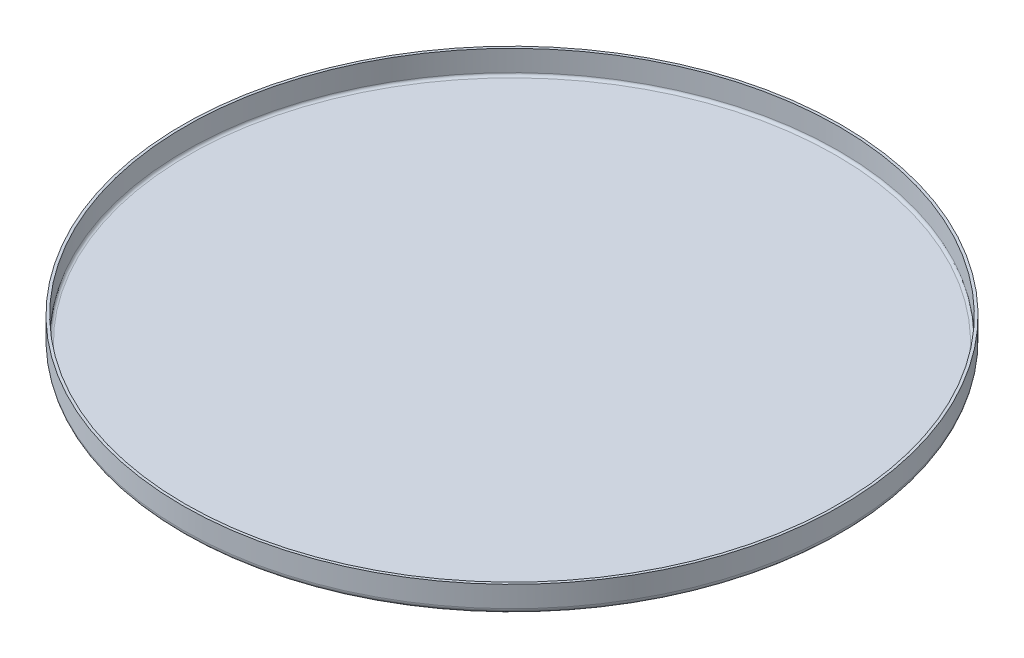
ISO-10303-21;
HEADER;
FILE_DESCRIPTION(('STEP AP214'),'2;1');
FILE_NAME('part.step','',(''),(''),'','','');
FILE_SCHEMA(('AUTOMOTIVE_DESIGN { 1 0 10303 214 1 1 1 1 }'));
ENDSEC;
DATA;
#1=APPLICATION_CONTEXT('core data for automotive mechanical design processes');
#2=APPLICATION_PROTOCOL_DEFINITION('international standard','automotive_design',2000,#1);
#3=PRODUCT_CONTEXT('',#1,'mechanical');
#4=PRODUCT('Part','Part','',(#3));
#5=PRODUCT_RELATED_PRODUCT_CATEGORY('part','',(#4));
#6=PRODUCT_DEFINITION_FORMATION('','',#4);
#7=PRODUCT_DEFINITION_CONTEXT('part definition',#1,'design');
#8=PRODUCT_DEFINITION('design','',#6,#7);
#9=PRODUCT_DEFINITION_SHAPE('','',#8);
#10=(LENGTH_UNIT() NAMED_UNIT(*) SI_UNIT(.MILLI.,.METRE.));
#11=(NAMED_UNIT(*) PLANE_ANGLE_UNIT() SI_UNIT($,.RADIAN.));
#12=(NAMED_UNIT(*) SI_UNIT($,.STERADIAN.) SOLID_ANGLE_UNIT());
#13=UNCERTAINTY_MEASURE_WITH_UNIT(LENGTH_MEASURE(1.E-05),#10,'distance_accuracy_value','');
#14=(GEOMETRIC_REPRESENTATION_CONTEXT(3) GLOBAL_UNCERTAINTY_ASSIGNED_CONTEXT((#13)) GLOBAL_UNIT_ASSIGNED_CONTEXT((#10,
#11,#12)) REPRESENTATION_CONTEXT('',''));
#15=CARTESIAN_POINT('',(0.,0.,0.));
#16=DIRECTION('',(0.,0.,1.));
#17=DIRECTION('',(1.,0.,0.));
#18=AXIS2_PLACEMENT_3D('',#15,#16,#17);
#19=CARTESIAN_POINT('',(0.,-0.0254,0.));
#20=DIRECTION('',(0.,1.,0.));
#21=DIRECTION('',(0.,0.,1.));
#22=AXIS2_PLACEMENT_3D('',#19,#20,#21);
#23=PLANE('',#22);
#24=CARTESIAN_POINT('',(0.,-0.0254,0.));
#25=DIRECTION('',(0.,1.,0.));
#26=DIRECTION('',(0.,0.,1.));
#27=AXIS2_PLACEMENT_3D('',#24,#25,#26);
#28=CIRCLE('',#27,3.1242);
#29=CARTESIAN_POINT('',(0.,-0.0254,3.1242));
#30=VERTEX_POINT('',#29);
#31=EDGE_CURVE('E12',#30,#30,#28,.T.);
#32=ORIENTED_EDGE('',*,*,#31,.F.);
#33=EDGE_LOOP('',(#32));
#34=FACE_BOUND('',#33,.T.);
#35=ADVANCED_FACE('F92',(#34),#23,.F.);
#36=CARTESIAN_POINT('',(0.,0.2286,0.));
#37=DIRECTION('',(0.,-1.,0.));
#38=DIRECTION('',(0.,0.,-1.));
#39=AXIS2_PLACEMENT_3D('',#36,#37,#38);
#40=PLANE('',#39);
#41=CARTESIAN_POINT('',(0.,0.2286,0.));
#42=DIRECTION('',(0.,1.,0.));
#43=DIRECTION('',(0.,0.,1.));
#44=AXIS2_PLACEMENT_3D('',#41,#42,#43);
#45=CIRCLE('',#44,3.175);
#46=CARTESIAN_POINT('',(0.,0.2286,3.175));
#47=VERTEX_POINT('',#46);
#48=EDGE_CURVE('E139',#47,#47,#45,.T.);
#49=ORIENTED_EDGE('',*,*,#48,.T.);
#50=EDGE_LOOP('',(#49));
#51=FACE_BOUND('',#50,.T.);
#52=CARTESIAN_POINT('',(0.,0.2286,0.));
#53=DIRECTION('',(0.,1.,0.));
#54=DIRECTION('',(0.,0.,1.));
#55=AXIS2_PLACEMENT_3D('',#52,#53,#54);
#56=CIRCLE('',#55,3.1496);
#57=CARTESIAN_POINT('',(0.,0.2286,3.1496));
#58=VERTEX_POINT('',#57);
#59=EDGE_CURVE('E140',#58,#58,#56,.T.);
#60=ORIENTED_EDGE('',*,*,#59,.F.);
#61=EDGE_LOOP('',(#60));
#62=FACE_BOUND('',#61,.T.);
#63=ADVANCED_FACE('F163',(#51,#62),#40,.F.);
#64=CARTESIAN_POINT('',(0.,0.,0.));
#65=DIRECTION('',(0.,1.,0.));
#66=DIRECTION('',(0.,0.,1.));
#67=AXIS2_PLACEMENT_3D('',#64,#65,#66);
#68=CYLINDRICAL_SURFACE('',#67,3.1496);
#69=DIRECTION('',(0.,1.,0.));
#70=VECTOR('',#69,1.);
#71=CARTESIAN_POINT('',(0.,0.,3.1496));
#72=LINE('',#71,#70);
#73=CARTESIAN_POINT('',(0.,0.0254,3.1496));
#74=VERTEX_POINT('',#73);
#75=EDGE_CURVE('E149',#74,#58,#72,.T.);
#76=ORIENTED_EDGE('',*,*,#75,.F.);
#77=CARTESIAN_POINT('',(0.,0.0254,0.));
#78=DIRECTION('',(0.,1.,0.));
#79=DIRECTION('',(0.,0.,1.));
#80=AXIS2_PLACEMENT_3D('',#77,#78,#79);
#81=CIRCLE('',#80,3.1496);
#82=EDGE_CURVE('E141',#74,#74,#81,.T.);
#83=ORIENTED_EDGE('',*,*,#82,.F.);
#84=ORIENTED_EDGE('',*,*,#75,.T.);
#85=ORIENTED_EDGE('',*,*,#59,.T.);
#86=EDGE_LOOP('',(#76,#83,#84,#85));
#87=FACE_BOUND('',#86,.T.);
#88=ADVANCED_FACE('F167',(#87),#68,.F.);
#89=CARTESIAN_POINT('',(0.,0.0254,0.));
#90=DIRECTION('',(0.,1.,0.));
#91=DIRECTION('',(0.,0.,1.));
#92=AXIS2_PLACEMENT_3D('',#89,#90,#91);
#93=TOROIDAL_SURFACE('',#92,3.1242,0.0254);
#94=CARTESIAN_POINT('',(0.,0.0254,3.1242));
#95=DIRECTION('',(1.,0.,0.));
#96=DIRECTION('',(0.,0.,-1.));
#97=AXIS2_PLACEMENT_3D('',#94,#95,#96);
#98=CIRCLE('',#97,0.0254);
#99=CARTESIAN_POINT('',(0.,0.,3.1242));
#100=VERTEX_POINT('',#99);
#101=EDGE_CURVE('E107',#100,#74,#98,.F.);
#102=ORIENTED_EDGE('',*,*,#101,.F.);
#103=CARTESIAN_POINT('',(0.,0.,0.));
#104=DIRECTION('',(0.,1.,0.));
#105=DIRECTION('',(0.,0.,1.));
#106=AXIS2_PLACEMENT_3D('',#103,#104,#105);
#107=CIRCLE('',#106,3.1242);
#108=EDGE_CURVE('E146',#100,#100,#107,.T.);
#109=ORIENTED_EDGE('',*,*,#108,.F.);
#110=ORIENTED_EDGE('',*,*,#101,.T.);
#111=ORIENTED_EDGE('',*,*,#82,.T.);
#112=EDGE_LOOP('',(#102,#109,#110,#111));
#113=FACE_BOUND('',#112,.T.);
#114=ADVANCED_FACE('F153',(#113),#93,.F.);
#115=CARTESIAN_POINT('',(0.,0.,0.));
#116=DIRECTION('',(0.,1.,0.));
#117=DIRECTION('',(0.,0.,1.));
#118=AXIS2_PLACEMENT_3D('',#115,#116,#117);
#119=CYLINDRICAL_SURFACE('',#118,3.175);
#120=DIRECTION('',(0.,1.,0.));
#121=VECTOR('',#120,1.);
#122=CARTESIAN_POINT('',(0.,0.,3.175));
#123=LINE('',#122,#121);
#124=CARTESIAN_POINT('',(0.,0.0254,3.175));
#125=VERTEX_POINT('',#124);
#126=EDGE_CURVE('E133',#125,#47,#123,.T.);
#127=ORIENTED_EDGE('',*,*,#126,.T.);
#128=ORIENTED_EDGE('',*,*,#48,.F.);
#129=ORIENTED_EDGE('',*,*,#126,.F.);
#130=CARTESIAN_POINT('',(0.,0.0254,0.));
#131=DIRECTION('',(0.,1.,0.));
#132=DIRECTION('',(0.,0.,1.));
#133=AXIS2_PLACEMENT_3D('',#130,#131,#132);
#134=CIRCLE('',#133,3.175);
#135=EDGE_CURVE('E131',#125,#125,#134,.T.);
#136=ORIENTED_EDGE('',*,*,#135,.T.);
#137=EDGE_LOOP('',(#127,#128,#129,#136));
#138=FACE_BOUND('',#137,.T.);
#139=ADVANCED_FACE('F160',(#138),#119,.T.);
#140=CARTESIAN_POINT('',(0.,0.0254,0.));
#141=DIRECTION('',(0.,1.,0.));
#142=DIRECTION('',(0.,0.,1.));
#143=AXIS2_PLACEMENT_3D('',#140,#141,#142);
#144=TOROIDAL_SURFACE('',#143,3.1242,0.0508);
#145=CARTESIAN_POINT('',(0.,0.0254,3.1242));
#146=DIRECTION('',(-1.,0.,0.));
#147=DIRECTION('',(0.,0.,1.));
#148=AXIS2_PLACEMENT_3D('',#145,#146,#147);
#149=CIRCLE('',#148,0.0508);
#150=EDGE_CURVE('E128',#30,#125,#149,.T.);
#151=ORIENTED_EDGE('',*,*,#150,.T.);
#152=ORIENTED_EDGE('',*,*,#135,.F.);
#153=ORIENTED_EDGE('',*,*,#150,.F.);
#154=ORIENTED_EDGE('',*,*,#31,.T.);
#155=EDGE_LOOP('',(#151,#152,#153,#154));
#156=FACE_BOUND('',#155,.T.);
#157=ADVANCED_FACE('F129',(#156),#144,.T.);
#158=CARTESIAN_POINT('',(0.,0.,0.));
#159=DIRECTION('',(0.,1.,0.));
#160=DIRECTION('',(0.,0.,1.));
#161=AXIS2_PLACEMENT_3D('',#158,#159,#160);
#162=PLANE('',#161);
#163=ORIENTED_EDGE('',*,*,#108,.T.);
#164=EDGE_LOOP('',(#163));
#165=FACE_BOUND('',#164,.T.);
#166=ADVANCED_FACE('F94',(#165),#162,.T.);
#167=CLOSED_SHELL('',(#35,#63,#88,#114,#139,#157,#166));
#168=MANIFOLD_SOLID_BREP('B2',#167);
#169=ADVANCED_BREP_SHAPE_REPRESENTATION('',(#18,#168),#14);
#170=SHAPE_DEFINITION_REPRESENTATION(#9,#169);
ENDSEC;
END-ISO-10303-21;
